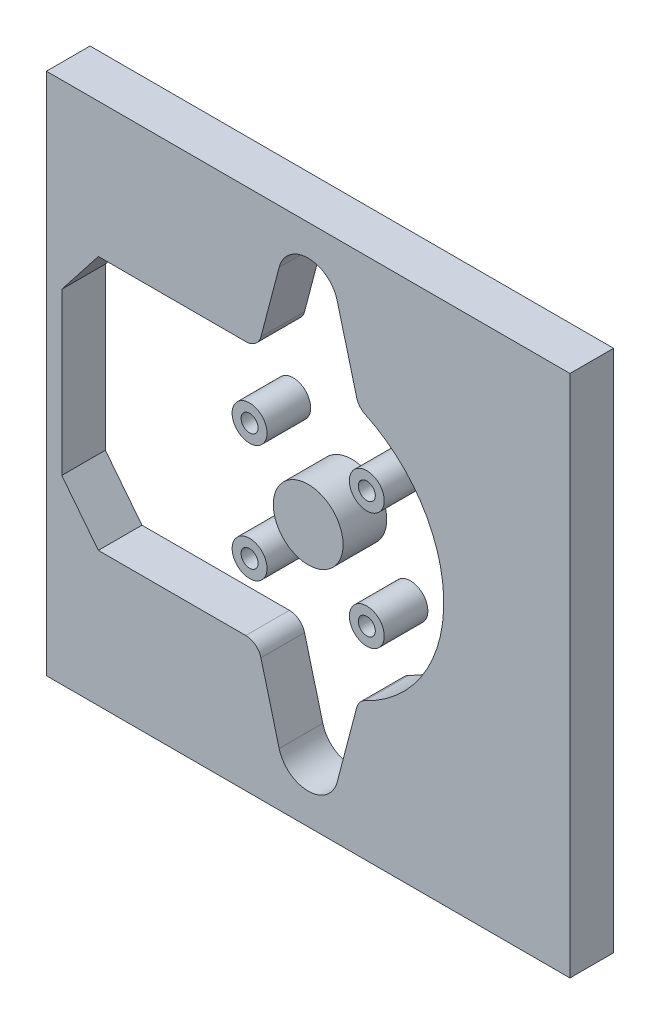
ISO-10303-21;
HEADER;
FILE_DESCRIPTION(('STEP AP214'),'2;1');
FILE_NAME('part.step','',(''),(''),'','','');
FILE_SCHEMA(('AUTOMOTIVE_DESIGN { 1 0 10303 214 1 1 1 1 }'));
ENDSEC;
DATA;
#1=APPLICATION_CONTEXT('core data for automotive mechanical design processes');
#2=APPLICATION_PROTOCOL_DEFINITION('international standard','automotive_design',2000,#1);
#3=PRODUCT_CONTEXT('',#1,'mechanical');
#4=PRODUCT('Part','Part','',(#3));
#5=PRODUCT_RELATED_PRODUCT_CATEGORY('part','',(#4));
#6=PRODUCT_DEFINITION_FORMATION('','',#4);
#7=PRODUCT_DEFINITION_CONTEXT('part definition',#1,'design');
#8=PRODUCT_DEFINITION('design','',#6,#7);
#9=PRODUCT_DEFINITION_SHAPE('','',#8);
#10=(LENGTH_UNIT() NAMED_UNIT(*) SI_UNIT(.MILLI.,.METRE.));
#11=(NAMED_UNIT(*) PLANE_ANGLE_UNIT() SI_UNIT($,.RADIAN.));
#12=(NAMED_UNIT(*) SI_UNIT($,.STERADIAN.) SOLID_ANGLE_UNIT());
#13=UNCERTAINTY_MEASURE_WITH_UNIT(LENGTH_MEASURE(1.E-05),#10,'distance_accuracy_value','');
#14=(GEOMETRIC_REPRESENTATION_CONTEXT(3) GLOBAL_UNCERTAINTY_ASSIGNED_CONTEXT((#13)) GLOBAL_UNIT_ASSIGNED_CONTEXT((#10,
#11,#12)) REPRESENTATION_CONTEXT('',''));
#15=CARTESIAN_POINT('',(0.,0.,0.));
#16=DIRECTION('',(0.,0.,1.));
#17=DIRECTION('',(1.,0.,0.));
#18=AXIS2_PLACEMENT_3D('',#15,#16,#17);
#19=CARTESIAN_POINT('',(-6.71751442127221,6.71751442127219,5.));
#20=DIRECTION('',(0.,0.,-1.));
#21=DIRECTION('',(-1.,0.,0.));
#22=AXIS2_PLACEMENT_3D('',#19,#20,#21);
#23=CYLINDRICAL_SURFACE('',#22,2.);
#24=CARTESIAN_POINT('',(-6.71751442127221,6.71751442127219,5.));
#25=DIRECTION('',(0.,0.,-1.));
#26=DIRECTION('',(-1.,0.,0.));
#27=AXIS2_PLACEMENT_3D('',#24,#25,#26);
#28=CIRCLE('',#27,2.);
#29=CARTESIAN_POINT('',(-8.71751442127221,6.71751442127219,5.));
#30=VERTEX_POINT('',#29);
#31=EDGE_CURVE('E11',#30,#30,#28,.T.);
#32=ORIENTED_EDGE('',*,*,#31,.T.);
#33=EDGE_LOOP('',(#32));
#34=FACE_BOUND('',#33,.T.);
#35=CARTESIAN_POINT('',(-6.71751442127221,6.71751442127219,0.));
#36=DIRECTION('',(0.,0.,-1.));
#37=DIRECTION('',(-1.,0.,0.));
#38=AXIS2_PLACEMENT_3D('',#35,#36,#37);
#39=CIRCLE('',#38,2.);
#40=CARTESIAN_POINT('',(-8.71751442127221,6.71751442127219,0.));
#41=VERTEX_POINT('',#40);
#42=EDGE_CURVE('E47',#41,#41,#39,.T.);
#43=ORIENTED_EDGE('',*,*,#42,.F.);
#44=EDGE_LOOP('',(#43));
#45=FACE_BOUND('',#44,.T.);
#46=ADVANCED_FACE('F44',(#34,#45),#23,.T.);
#47=CARTESIAN_POINT('',(-6.71751442127221,6.71751442127219,5.));
#48=DIRECTION('',(0.,0.,-1.));
#49=DIRECTION('',(-1.,0.,0.));
#50=AXIS2_PLACEMENT_3D('',#47,#48,#49);
#51=PLANE('',#50);
#52=CARTESIAN_POINT('',(-6.71751442127221,6.71751442127219,5.));
#53=DIRECTION('',(0.,0.,-1.));
#54=DIRECTION('',(-1.,0.,0.));
#55=AXIS2_PLACEMENT_3D('',#52,#53,#54);
#56=CIRCLE('',#55,0.975);
#57=CARTESIAN_POINT('',(-7.69251442127221,6.71751442127219,5.));
#58=VERTEX_POINT('',#57);
#59=EDGE_CURVE('E54',#58,#58,#56,.T.);
#60=ORIENTED_EDGE('',*,*,#59,.T.);
#61=EDGE_LOOP('',(#60));
#62=FACE_BOUND('',#61,.T.);
#63=ORIENTED_EDGE('',*,*,#31,.F.);
#64=EDGE_LOOP('',(#63));
#65=FACE_BOUND('',#64,.T.);
#66=ADVANCED_FACE('F62',(#62,#65),#51,.F.);
#67=CARTESIAN_POINT('',(-6.71751442127221,6.71751442127219,0.));
#68=DIRECTION('',(0.,0.,-1.));
#69=DIRECTION('',(-1.,0.,0.));
#70=AXIS2_PLACEMENT_3D('',#67,#68,#69);
#71=PLANE('',#70);
#72=CARTESIAN_POINT('',(-6.71751442127221,6.71751442127219,0.));
#73=DIRECTION('',(0.,0.,-1.));
#74=DIRECTION('',(-1.,0.,0.));
#75=AXIS2_PLACEMENT_3D('',#72,#73,#74);
#76=CIRCLE('',#75,0.975);
#77=CARTESIAN_POINT('',(-7.69251442127221,6.71751442127219,0.));
#78=VERTEX_POINT('',#77);
#79=EDGE_CURVE('E56',#78,#78,#76,.T.);
#80=ORIENTED_EDGE('',*,*,#79,.F.);
#81=EDGE_LOOP('',(#80));
#82=FACE_BOUND('',#81,.T.);
#83=ORIENTED_EDGE('',*,*,#42,.T.);
#84=EDGE_LOOP('',(#83));
#85=FACE_BOUND('',#84,.T.);
#86=ADVANCED_FACE('F68',(#82,#85),#71,.T.);
#87=CARTESIAN_POINT('',(-6.71751442127221,6.71751442127219,5.));
#88=DIRECTION('',(0.,0.,-1.));
#89=DIRECTION('',(-1.,0.,0.));
#90=AXIS2_PLACEMENT_3D('',#87,#88,#89);
#91=CYLINDRICAL_SURFACE('',#90,0.975);
#92=ORIENTED_EDGE('',*,*,#59,.F.);
#93=EDGE_LOOP('',(#92));
#94=FACE_BOUND('',#93,.T.);
#95=ORIENTED_EDGE('',*,*,#79,.T.);
#96=EDGE_LOOP('',(#95));
#97=FACE_BOUND('',#96,.T.);
#98=ADVANCED_FACE('F65',(#94,#97),#91,.F.);
#99=CLOSED_SHELL('',(#46,#66,#86,#98));
#100=MANIFOLD_SOLID_BREP('B2',#99);
#101=CARTESIAN_POINT('',(-6.71751442127221,-6.71751442127219,5.));
#102=DIRECTION('',(0.,0.,-1.));
#103=DIRECTION('',(-1.,0.,0.));
#104=AXIS2_PLACEMENT_3D('',#101,#102,#103);
#105=CYLINDRICAL_SURFACE('',#104,2.);
#106=CARTESIAN_POINT('',(-6.71751442127221,-6.71751442127219,5.));
#107=DIRECTION('',(0.,0.,-1.));
#108=DIRECTION('',(1.,0.,0.));
#109=AXIS2_PLACEMENT_3D('',#106,#107,#108);
#110=CIRCLE('',#109,2.);
#111=CARTESIAN_POINT('',(-4.71751442127221,-6.71751442127219,5.));
#112=VERTEX_POINT('',#111);
#113=EDGE_CURVE('E43',#112,#112,#110,.T.);
#114=ORIENTED_EDGE('',*,*,#113,.T.);
#115=EDGE_LOOP('',(#114));
#116=FACE_BOUND('',#115,.T.);
#117=CARTESIAN_POINT('',(-6.71751442127221,-6.71751442127219,0.));
#118=DIRECTION('',(0.,0.,-1.));
#119=DIRECTION('',(1.,0.,0.));
#120=AXIS2_PLACEMENT_3D('',#117,#118,#119);
#121=CIRCLE('',#120,2.);
#122=CARTESIAN_POINT('',(-4.71751442127221,-6.71751442127219,0.));
#123=VERTEX_POINT('',#122);
#124=EDGE_CURVE('E117',#123,#123,#121,.T.);
#125=ORIENTED_EDGE('',*,*,#124,.F.);
#126=EDGE_LOOP('',(#125));
#127=FACE_BOUND('',#126,.T.);
#128=ADVANCED_FACE('F114',(#116,#127),#105,.T.);
#129=CARTESIAN_POINT('',(-6.71751442127221,-6.71751442127219,5.));
#130=DIRECTION('',(0.,0.,1.));
#131=DIRECTION('',(1.,0.,0.));
#132=AXIS2_PLACEMENT_3D('',#129,#130,#131);
#133=PLANE('',#132);
#134=CARTESIAN_POINT('',(-6.71751442127221,-6.71751442127219,5.));
#135=DIRECTION('',(0.,0.,-1.));
#136=DIRECTION('',(-1.,0.,0.));
#137=AXIS2_PLACEMENT_3D('',#134,#135,#136);
#138=CIRCLE('',#137,0.975);
#139=CARTESIAN_POINT('',(-7.69251442127221,-6.71751442127219,5.));
#140=VERTEX_POINT('',#139);
#141=EDGE_CURVE('E124',#140,#140,#138,.T.);
#142=ORIENTED_EDGE('',*,*,#141,.T.);
#143=EDGE_LOOP('',(#142));
#144=FACE_BOUND('',#143,.T.);
#145=ORIENTED_EDGE('',*,*,#113,.F.);
#146=EDGE_LOOP('',(#145));
#147=FACE_BOUND('',#146,.T.);
#148=ADVANCED_FACE('F132',(#144,#147),#133,.T.);
#149=CARTESIAN_POINT('',(-6.71751442127221,-6.71751442127219,0.));
#150=DIRECTION('',(0.,0.,1.));
#151=DIRECTION('',(1.,0.,0.));
#152=AXIS2_PLACEMENT_3D('',#149,#150,#151);
#153=PLANE('',#152);
#154=CARTESIAN_POINT('',(-6.71751442127221,-6.71751442127219,0.));
#155=DIRECTION('',(0.,0.,-1.));
#156=DIRECTION('',(-1.,0.,0.));
#157=AXIS2_PLACEMENT_3D('',#154,#155,#156);
#158=CIRCLE('',#157,0.975);
#159=CARTESIAN_POINT('',(-7.69251442127221,-6.71751442127219,0.));
#160=VERTEX_POINT('',#159);
#161=EDGE_CURVE('E126',#160,#160,#158,.T.);
#162=ORIENTED_EDGE('',*,*,#161,.F.);
#163=EDGE_LOOP('',(#162));
#164=FACE_BOUND('',#163,.T.);
#165=ORIENTED_EDGE('',*,*,#124,.T.);
#166=EDGE_LOOP('',(#165));
#167=FACE_BOUND('',#166,.T.);
#168=ADVANCED_FACE('F138',(#164,#167),#153,.F.);
#169=CARTESIAN_POINT('',(-6.71751442127221,-6.71751442127219,5.));
#170=DIRECTION('',(0.,0.,-1.));
#171=DIRECTION('',(-1.,0.,0.));
#172=AXIS2_PLACEMENT_3D('',#169,#170,#171);
#173=CYLINDRICAL_SURFACE('',#172,0.975);
#174=ORIENTED_EDGE('',*,*,#141,.F.);
#175=EDGE_LOOP('',(#174));
#176=FACE_BOUND('',#175,.T.);
#177=ORIENTED_EDGE('',*,*,#161,.T.);
#178=EDGE_LOOP('',(#177));
#179=FACE_BOUND('',#178,.T.);
#180=ADVANCED_FACE('F135',(#176,#179),#173,.F.);
#181=CLOSED_SHELL('',(#128,#148,#168,#180));
#182=MANIFOLD_SOLID_BREP('B6',#181);
#183=CARTESIAN_POINT('',(6.71751442127221,6.71751442127219,5.));
#184=DIRECTION('',(0.,0.,-1.));
#185=DIRECTION('',(-1.,0.,0.));
#186=AXIS2_PLACEMENT_3D('',#183,#184,#185);
#187=CYLINDRICAL_SURFACE('',#186,2.);
#188=CARTESIAN_POINT('',(6.71751442127221,6.71751442127219,5.));
#189=DIRECTION('',(0.,0.,-1.));
#190=DIRECTION('',(1.,0.,0.));
#191=AXIS2_PLACEMENT_3D('',#188,#189,#190);
#192=CIRCLE('',#191,2.);
#193=CARTESIAN_POINT('',(8.71751442127221,6.71751442127219,5.));
#194=VERTEX_POINT('',#193);
#195=EDGE_CURVE('E113',#194,#194,#192,.T.);
#196=ORIENTED_EDGE('',*,*,#195,.T.);
#197=EDGE_LOOP('',(#196));
#198=FACE_BOUND('',#197,.T.);
#199=CARTESIAN_POINT('',(6.71751442127221,6.71751442127219,0.));
#200=DIRECTION('',(0.,0.,-1.));
#201=DIRECTION('',(1.,0.,0.));
#202=AXIS2_PLACEMENT_3D('',#199,#200,#201);
#203=CIRCLE('',#202,2.);
#204=CARTESIAN_POINT('',(8.71751442127221,6.71751442127219,0.));
#205=VERTEX_POINT('',#204);
#206=EDGE_CURVE('E187',#205,#205,#203,.T.);
#207=ORIENTED_EDGE('',*,*,#206,.F.);
#208=EDGE_LOOP('',(#207));
#209=FACE_BOUND('',#208,.T.);
#210=ADVANCED_FACE('F184',(#198,#209),#187,.T.);
#211=CARTESIAN_POINT('',(6.71751442127221,6.71751442127219,5.));
#212=DIRECTION('',(0.,0.,1.));
#213=DIRECTION('',(1.,0.,0.));
#214=AXIS2_PLACEMENT_3D('',#211,#212,#213);
#215=PLANE('',#214);
#216=CARTESIAN_POINT('',(6.71751442127221,6.71751442127219,5.));
#217=DIRECTION('',(0.,0.,-1.));
#218=DIRECTION('',(-1.,0.,0.));
#219=AXIS2_PLACEMENT_3D('',#216,#217,#218);
#220=CIRCLE('',#219,0.975);
#221=CARTESIAN_POINT('',(5.74251442127221,6.71751442127219,5.));
#222=VERTEX_POINT('',#221);
#223=EDGE_CURVE('E194',#222,#222,#220,.T.);
#224=ORIENTED_EDGE('',*,*,#223,.T.);
#225=EDGE_LOOP('',(#224));
#226=FACE_BOUND('',#225,.T.);
#227=ORIENTED_EDGE('',*,*,#195,.F.);
#228=EDGE_LOOP('',(#227));
#229=FACE_BOUND('',#228,.T.);
#230=ADVANCED_FACE('F202',(#226,#229),#215,.T.);
#231=CARTESIAN_POINT('',(6.71751442127221,6.71751442127219,0.));
#232=DIRECTION('',(0.,0.,1.));
#233=DIRECTION('',(1.,0.,0.));
#234=AXIS2_PLACEMENT_3D('',#231,#232,#233);
#235=PLANE('',#234);
#236=CARTESIAN_POINT('',(6.71751442127221,6.71751442127219,0.));
#237=DIRECTION('',(0.,0.,-1.));
#238=DIRECTION('',(-1.,0.,0.));
#239=AXIS2_PLACEMENT_3D('',#236,#237,#238);
#240=CIRCLE('',#239,0.975);
#241=CARTESIAN_POINT('',(5.74251442127221,6.71751442127219,0.));
#242=VERTEX_POINT('',#241);
#243=EDGE_CURVE('E196',#242,#242,#240,.T.);
#244=ORIENTED_EDGE('',*,*,#243,.F.);
#245=EDGE_LOOP('',(#244));
#246=FACE_BOUND('',#245,.T.);
#247=ORIENTED_EDGE('',*,*,#206,.T.);
#248=EDGE_LOOP('',(#247));
#249=FACE_BOUND('',#248,.T.);
#250=ADVANCED_FACE('F208',(#246,#249),#235,.F.);
#251=CARTESIAN_POINT('',(6.71751442127221,6.71751442127219,5.));
#252=DIRECTION('',(0.,0.,-1.));
#253=DIRECTION('',(-1.,0.,0.));
#254=AXIS2_PLACEMENT_3D('',#251,#252,#253);
#255=CYLINDRICAL_SURFACE('',#254,0.975);
#256=ORIENTED_EDGE('',*,*,#223,.F.);
#257=EDGE_LOOP('',(#256));
#258=FACE_BOUND('',#257,.T.);
#259=ORIENTED_EDGE('',*,*,#243,.T.);
#260=EDGE_LOOP('',(#259));
#261=FACE_BOUND('',#260,.T.);
#262=ADVANCED_FACE('F205',(#258,#261),#255,.F.);
#263=CLOSED_SHELL('',(#210,#230,#250,#262));
#264=MANIFOLD_SOLID_BREP('B38',#263);
#265=CARTESIAN_POINT('',(6.71751442127221,-6.71751442127219,5.));
#266=DIRECTION('',(0.,0.,-1.));
#267=DIRECTION('',(-1.,0.,0.));
#268=AXIS2_PLACEMENT_3D('',#265,#266,#267);
#269=CYLINDRICAL_SURFACE('',#268,2.);
#270=CARTESIAN_POINT('',(6.71751442127221,-6.71751442127219,5.));
#271=DIRECTION('',(0.,0.,-1.));
#272=DIRECTION('',(-1.,0.,0.));
#273=AXIS2_PLACEMENT_3D('',#270,#271,#272);
#274=CIRCLE('',#273,2.);
#275=CARTESIAN_POINT('',(4.71751442127221,-6.71751442127219,5.));
#276=VERTEX_POINT('',#275);
#277=EDGE_CURVE('E183',#276,#276,#274,.T.);
#278=ORIENTED_EDGE('',*,*,#277,.T.);
#279=EDGE_LOOP('',(#278));
#280=FACE_BOUND('',#279,.T.);
#281=CARTESIAN_POINT('',(6.71751442127221,-6.71751442127219,0.));
#282=DIRECTION('',(0.,0.,-1.));
#283=DIRECTION('',(-1.,0.,0.));
#284=AXIS2_PLACEMENT_3D('',#281,#282,#283);
#285=CIRCLE('',#284,2.);
#286=CARTESIAN_POINT('',(4.71751442127221,-6.71751442127219,0.));
#287=VERTEX_POINT('',#286);
#288=EDGE_CURVE('E259',#287,#287,#285,.T.);
#289=ORIENTED_EDGE('',*,*,#288,.F.);
#290=EDGE_LOOP('',(#289));
#291=FACE_BOUND('',#290,.T.);
#292=ADVANCED_FACE('F256',(#280,#291),#269,.T.);
#293=CARTESIAN_POINT('',(6.71751442127221,-6.71751442127219,5.));
#294=DIRECTION('',(0.,0.,-1.));
#295=DIRECTION('',(-1.,0.,0.));
#296=AXIS2_PLACEMENT_3D('',#293,#294,#295);
#297=PLANE('',#296);
#298=CARTESIAN_POINT('',(6.71751442127221,-6.71751442127219,5.));
#299=DIRECTION('',(0.,0.,-1.));
#300=DIRECTION('',(-1.,0.,0.));
#301=AXIS2_PLACEMENT_3D('',#298,#299,#300);
#302=CIRCLE('',#301,0.975);
#303=CARTESIAN_POINT('',(5.74251442127221,-6.71751442127219,5.));
#304=VERTEX_POINT('',#303);
#305=EDGE_CURVE('E266',#304,#304,#302,.T.);
#306=ORIENTED_EDGE('',*,*,#305,.T.);
#307=EDGE_LOOP('',(#306));
#308=FACE_BOUND('',#307,.T.);
#309=ORIENTED_EDGE('',*,*,#277,.F.);
#310=EDGE_LOOP('',(#309));
#311=FACE_BOUND('',#310,.T.);
#312=ADVANCED_FACE('F274',(#308,#311),#297,.F.);
#313=CARTESIAN_POINT('',(6.71751442127221,-6.71751442127219,0.));
#314=DIRECTION('',(0.,0.,-1.));
#315=DIRECTION('',(-1.,0.,0.));
#316=AXIS2_PLACEMENT_3D('',#313,#314,#315);
#317=PLANE('',#316);
#318=CARTESIAN_POINT('',(6.71751442127221,-6.71751442127219,0.));
#319=DIRECTION('',(0.,0.,-1.));
#320=DIRECTION('',(-1.,0.,0.));
#321=AXIS2_PLACEMENT_3D('',#318,#319,#320);
#322=CIRCLE('',#321,0.975);
#323=CARTESIAN_POINT('',(5.74251442127221,-6.71751442127219,0.));
#324=VERTEX_POINT('',#323);
#325=EDGE_CURVE('E268',#324,#324,#322,.T.);
#326=ORIENTED_EDGE('',*,*,#325,.F.);
#327=EDGE_LOOP('',(#326));
#328=FACE_BOUND('',#327,.T.);
#329=ORIENTED_EDGE('',*,*,#288,.T.);
#330=EDGE_LOOP('',(#329));
#331=FACE_BOUND('',#330,.T.);
#332=ADVANCED_FACE('F280',(#328,#331),#317,.T.);
#333=CARTESIAN_POINT('',(6.71751442127221,-6.71751442127219,5.));
#334=DIRECTION('',(0.,0.,-1.));
#335=DIRECTION('',(-1.,0.,0.));
#336=AXIS2_PLACEMENT_3D('',#333,#334,#335);
#337=CYLINDRICAL_SURFACE('',#336,0.975);
#338=ORIENTED_EDGE('',*,*,#305,.F.);
#339=EDGE_LOOP('',(#338));
#340=FACE_BOUND('',#339,.T.);
#341=ORIENTED_EDGE('',*,*,#325,.T.);
#342=EDGE_LOOP('',(#341));
#343=FACE_BOUND('',#342,.T.);
#344=ADVANCED_FACE('F277',(#340,#343),#337,.F.);
#345=CLOSED_SHELL('',(#292,#312,#332,#344));
#346=MANIFOLD_SOLID_BREP('B108',#345);
#347=CARTESIAN_POINT('',(0.,0.,5.));
#348=DIRECTION('',(0.,0.,1.));
#349=DIRECTION('',(1.,0.,0.));
#350=AXIS2_PLACEMENT_3D('',#347,#348,#349);
#351=PLANE('',#350);
#352=DIRECTION('',(0.,-1.,0.));
#353=VECTOR('',#352,1.);
#354=CARTESIAN_POINT('',(-30.,30.,5.));
#355=LINE('',#354,#353);
#356=CARTESIAN_POINT('',(-30.,30.,5.));
#357=VERTEX_POINT('',#356);
#358=CARTESIAN_POINT('',(-30.,-30.,5.));
#359=VERTEX_POINT('',#358);
#360=EDGE_CURVE('E328',#357,#359,#355,.T.);
#361=ORIENTED_EDGE('',*,*,#360,.T.);
#362=DIRECTION('',(1.,0.,0.));
#363=VECTOR('',#362,1.);
#364=CARTESIAN_POINT('',(-30.,-30.,5.));
#365=LINE('',#364,#363);
#366=CARTESIAN_POINT('',(30.,-30.,5.));
#367=VERTEX_POINT('',#366);
#368=EDGE_CURVE('E613',#359,#367,#365,.T.);
#369=ORIENTED_EDGE('',*,*,#368,.T.);
#370=DIRECTION('',(0.,1.,0.));
#371=VECTOR('',#370,1.);
#372=CARTESIAN_POINT('',(30.,30.,5.));
#373=LINE('',#372,#371);
#374=CARTESIAN_POINT('',(30.,30.,5.));
#375=VERTEX_POINT('',#374);
#376=EDGE_CURVE('E612',#367,#375,#373,.T.);
#377=ORIENTED_EDGE('',*,*,#376,.T.);
#378=DIRECTION('',(-1.,0.,0.));
#379=VECTOR('',#378,1.);
#380=CARTESIAN_POINT('',(-30.,30.,5.));
#381=LINE('',#380,#379);
#382=EDGE_CURVE('E610',#375,#357,#381,.T.);
#383=ORIENTED_EDGE('',*,*,#382,.T.);
#384=EDGE_LOOP('',(#361,#369,#377,#383));
#385=FACE_BOUND('',#384,.T.);
#386=DIRECTION('',(0.,1.,0.));
#387=VECTOR('',#386,1.);
#388=CARTESIAN_POINT('',(-28.24,-9.23903975314602,5.));
#389=LINE('',#388,#387);
#390=CARTESIAN_POINT('',(-28.24,-9.23903975314602,5.));
#391=VERTEX_POINT('',#390);
#392=CARTESIAN_POINT('',(-28.24,9.23903975314603,5.));
#393=VERTEX_POINT('',#392);
#394=EDGE_CURVE('E465',#391,#393,#389,.T.);
#395=ORIENTED_EDGE('',*,*,#394,.T.);
#396=DIRECTION('',(0.616887828188147,0.787051083115519,0.));
#397=VECTOR('',#396,1.);
#398=CARTESIAN_POINT('',(-28.24,9.23903975314603,5.));
#399=LINE('',#398,#397);
#400=CARTESIAN_POINT('',(-24.0498554502874,14.585,5.));
#401=VERTEX_POINT('',#400);
#402=EDGE_CURVE('E474',#393,#401,#399,.T.);
#403=ORIENTED_EDGE('',*,*,#402,.T.);
#404=DIRECTION('',(1.,0.,0.));
#405=VECTOR('',#404,1.);
#406=CARTESIAN_POINT('',(-24.0498554502874,14.585,5.));
#407=LINE('',#406,#405);
#408=CARTESIAN_POINT('',(-7.15516550456273,14.585,5.));
#409=VERTEX_POINT('',#408);
#410=EDGE_CURVE('E341',#401,#409,#407,.T.);
#411=ORIENTED_EDGE('',*,*,#410,.T.);
#412=CARTESIAN_POINT('',(-7.15516550456273,16.385,5.));
#413=DIRECTION('',(0.,0.,1.));
#414=DIRECTION('',(-1.,0.,0.));
#415=AXIS2_PLACEMENT_3D('',#412,#413,#414);
#416=CIRCLE('',#415,1.8);
#417=CARTESIAN_POINT('',(-5.41417686667612,15.9278801439997,5.));
#418=VERTEX_POINT('',#417);
#419=EDGE_CURVE('E487',#409,#418,#416,.T.);
#420=ORIENTED_EDGE('',*,*,#419,.T.);
#421=DIRECTION('',(0.253955475555716,0.967215909937006,0.));
#422=VECTOR('',#421,1.);
#423=CARTESIAN_POINT('',(-5.41417686667612,15.9278801439997,5.));
#424=LINE('',#423,#422);
#425=CARTESIAN_POINT('',(-3.32480469040846,23.8854719472228,5.));
#426=VERTEX_POINT('',#425);
#427=EDGE_CURVE('E490',#418,#426,#424,.T.);
#428=ORIENTED_EDGE('',*,*,#427,.T.);
#429=CARTESIAN_POINT('',(0.,23.0125,5.));
#430=DIRECTION('',(0.,0.,-1.));
#431=DIRECTION('',(-1.,0.,0.));
#432=AXIS2_PLACEMENT_3D('',#429,#430,#431);
#433=CIRCLE('',#432,3.4375);
#434=CARTESIAN_POINT('',(3.32480469040846,23.8854719472228,5.));
#435=VERTEX_POINT('',#434);
#436=EDGE_CURVE('E493',#426,#435,#433,.T.);
#437=ORIENTED_EDGE('',*,*,#436,.T.);
#438=DIRECTION('',(0.253955475555716,-0.967215909937006,0.));
#439=VECTOR('',#438,1.);
#440=CARTESIAN_POINT('',(3.32480469040846,23.8854719472228,5.));
#441=LINE('',#440,#439);
#442=CARTESIAN_POINT('',(5.55993505559416,15.3727448825266,5.));
#443=VERTEX_POINT('',#442);
#444=EDGE_CURVE('E496',#435,#443,#441,.T.);
#445=ORIENTED_EDGE('',*,*,#444,.T.);
#446=CARTESIAN_POINT('',(7.30092369348078,15.8298647385269,5.));
#447=DIRECTION('',(0.,0.,1.));
#448=DIRECTION('',(-1.,0.,0.));
#449=AXIS2_PLACEMENT_3D('',#446,#447,#448);
#450=CIRCLE('',#449,1.8);
#451=CARTESIAN_POINT('',(6.53351439929418,14.201650079707,5.));
#452=VERTEX_POINT('',#451);
#453=EDGE_CURVE('E499',#443,#452,#450,.T.);
#454=ORIENTED_EDGE('',*,*,#453,.T.);
#455=CARTESIAN_POINT('',(-0.160000000000004,0.,5.));
#456=DIRECTION('',(0.,0.,-1.));
#457=DIRECTION('',(-1.,0.,0.));
#458=AXIS2_PLACEMENT_3D('',#455,#456,#457);
#459=CIRCLE('',#458,15.7);
#460=CARTESIAN_POINT('',(6.53351439929418,-14.201650079707,5.));
#461=VERTEX_POINT('',#460);
#462=EDGE_CURVE('E502',#452,#461,#459,.T.);
#463=ORIENTED_EDGE('',*,*,#462,.T.);
#464=CARTESIAN_POINT('',(7.30092369348077,-15.8298647385269,5.));
#465=DIRECTION('',(0.,0.,1.));
#466=DIRECTION('',(-1.,0.,0.));
#467=AXIS2_PLACEMENT_3D('',#464,#465,#466);
#468=CIRCLE('',#467,1.8);
#469=CARTESIAN_POINT('',(5.55993505559416,-15.3727448825266,5.));
#470=VERTEX_POINT('',#469);
#471=EDGE_CURVE('E505',#461,#470,#468,.T.);
#472=ORIENTED_EDGE('',*,*,#471,.T.);
#473=DIRECTION('',(-0.253955475555716,-0.967215909937006,0.));
#474=VECTOR('',#473,1.);
#475=CARTESIAN_POINT('',(5.55993505559416,-15.3727448825266,5.));
#476=LINE('',#475,#474);
#477=CARTESIAN_POINT('',(3.32480469040846,-23.8854719472228,5.));
#478=VERTEX_POINT('',#477);
#479=EDGE_CURVE('E508',#470,#478,#476,.T.);
#480=ORIENTED_EDGE('',*,*,#479,.T.);
#481=CARTESIAN_POINT('',(0.,-23.0125,5.));
#482=DIRECTION('',(0.,0.,-1.));
#483=DIRECTION('',(-1.,0.,0.));
#484=AXIS2_PLACEMENT_3D('',#481,#482,#483);
#485=CIRCLE('',#484,3.4375);
#486=CARTESIAN_POINT('',(-3.32480469040846,-23.8854719472228,5.));
#487=VERTEX_POINT('',#486);
#488=EDGE_CURVE('E511',#478,#487,#485,.T.);
#489=ORIENTED_EDGE('',*,*,#488,.T.);
#490=DIRECTION('',(-0.253955475555716,0.967215909937006,0.));
#491=VECTOR('',#490,1.);
#492=CARTESIAN_POINT('',(-3.32480469040846,-23.8854719472228,5.));
#493=LINE('',#492,#491);
#494=CARTESIAN_POINT('',(-5.41417686667612,-15.9278801439997,5.));
#495=VERTEX_POINT('',#494);
#496=EDGE_CURVE('E514',#487,#495,#493,.T.);
#497=ORIENTED_EDGE('',*,*,#496,.T.);
#498=CARTESIAN_POINT('',(-7.15516550456273,-16.385,5.));
#499=DIRECTION('',(0.,0.,1.));
#500=DIRECTION('',(-1.,0.,0.));
#501=AXIS2_PLACEMENT_3D('',#498,#499,#500);
#502=CIRCLE('',#501,1.8);
#503=CARTESIAN_POINT('',(-7.15516550456273,-14.585,5.));
#504=VERTEX_POINT('',#503);
#505=EDGE_CURVE('E517',#495,#504,#502,.T.);
#506=ORIENTED_EDGE('',*,*,#505,.T.);
#507=DIRECTION('',(-1.,0.,0.));
#508=VECTOR('',#507,1.);
#509=CARTESIAN_POINT('',(-7.15516550456273,-14.585,5.));
#510=LINE('',#509,#508);
#511=CARTESIAN_POINT('',(-24.0498554502874,-14.585,5.));
#512=VERTEX_POINT('',#511);
#513=EDGE_CURVE('E520',#504,#512,#510,.T.);
#514=ORIENTED_EDGE('',*,*,#513,.T.);
#515=DIRECTION('',(-0.616887828188146,0.787051083115519,0.));
#516=VECTOR('',#515,1.);
#517=CARTESIAN_POINT('',(-24.0498554502874,-14.585,5.));
#518=LINE('',#517,#516);
#519=EDGE_CURVE('E471',#512,#391,#518,.T.);
#520=ORIENTED_EDGE('',*,*,#519,.T.);
#521=EDGE_LOOP('',(#395,#403,#411,#420,#428,#437,#445,#454,#463,#472,#480,#489,#497,#506,#514,#520));
#522=FACE_BOUND('',#521,.T.);
#523=ADVANCED_FACE('F325',(#385,#522),#351,.T.);
#524=CARTESIAN_POINT('',(0.,0.,0.));
#525=DIRECTION('',(0.,0.,1.));
#526=DIRECTION('',(1.,0.,0.));
#527=AXIS2_PLACEMENT_3D('',#524,#525,#526);
#528=PLANE('',#527);
#529=DIRECTION('',(0.,-1.,0.));
#530=VECTOR('',#529,1.);
#531=CARTESIAN_POINT('',(-30.,30.,0.));
#532=LINE('',#531,#530);
#533=CARTESIAN_POINT('',(-30.,30.,0.));
#534=VERTEX_POINT('',#533);
#535=CARTESIAN_POINT('',(-30.,-30.,0.));
#536=VERTEX_POINT('',#535);
#537=EDGE_CURVE('E604',#534,#536,#532,.T.);
#538=ORIENTED_EDGE('',*,*,#537,.F.);
#539=DIRECTION('',(-1.,0.,0.));
#540=VECTOR('',#539,1.);
#541=CARTESIAN_POINT('',(-30.,30.,0.));
#542=LINE('',#541,#540);
#543=CARTESIAN_POINT('',(30.,30.,0.));
#544=VERTEX_POINT('',#543);
#545=EDGE_CURVE('E333',#544,#534,#542,.T.);
#546=ORIENTED_EDGE('',*,*,#545,.F.);
#547=DIRECTION('',(0.,1.,0.));
#548=VECTOR('',#547,1.);
#549=CARTESIAN_POINT('',(30.,30.,0.));
#550=LINE('',#549,#548);
#551=CARTESIAN_POINT('',(30.,-30.,0.));
#552=VERTEX_POINT('',#551);
#553=EDGE_CURVE('E596',#552,#544,#550,.T.);
#554=ORIENTED_EDGE('',*,*,#553,.F.);
#555=DIRECTION('',(1.,0.,0.));
#556=VECTOR('',#555,1.);
#557=CARTESIAN_POINT('',(-30.,-30.,0.));
#558=LINE('',#557,#556);
#559=EDGE_CURVE('E597',#536,#552,#558,.T.);
#560=ORIENTED_EDGE('',*,*,#559,.F.);
#561=EDGE_LOOP('',(#538,#546,#554,#560));
#562=FACE_BOUND('',#561,.T.);
#563=DIRECTION('',(0.616887828188147,0.787051083115519,0.));
#564=VECTOR('',#563,1.);
#565=CARTESIAN_POINT('',(-28.24,9.23903975314603,0.));
#566=LINE('',#565,#564);
#567=CARTESIAN_POINT('',(-28.24,9.23903975314603,0.));
#568=VERTEX_POINT('',#567);
#569=CARTESIAN_POINT('',(-24.0498554502874,14.585,0.));
#570=VERTEX_POINT('',#569);
#571=EDGE_CURVE('E524',#568,#570,#566,.T.);
#572=ORIENTED_EDGE('',*,*,#571,.F.);
#573=DIRECTION('',(0.,1.,0.));
#574=VECTOR('',#573,1.);
#575=CARTESIAN_POINT('',(-28.24,-9.23903975314602,0.));
#576=LINE('',#575,#574);
#577=CARTESIAN_POINT('',(-28.24,-9.23903975314602,0.));
#578=VERTEX_POINT('',#577);
#579=EDGE_CURVE('E349',#578,#568,#576,.T.);
#580=ORIENTED_EDGE('',*,*,#579,.F.);
#581=DIRECTION('',(-0.616887828188146,0.787051083115519,0.));
#582=VECTOR('',#581,1.);
#583=CARTESIAN_POINT('',(-24.0498554502874,-14.585,0.));
#584=LINE('',#583,#582);
#585=CARTESIAN_POINT('',(-24.0498554502874,-14.585,0.));
#586=VERTEX_POINT('',#585);
#587=EDGE_CURVE('E480',#586,#578,#584,.T.);
#588=ORIENTED_EDGE('',*,*,#587,.F.);
#589=DIRECTION('',(-1.,0.,0.));
#590=VECTOR('',#589,1.);
#591=CARTESIAN_POINT('',(-7.15516550456273,-14.585,0.));
#592=LINE('',#591,#590);
#593=CARTESIAN_POINT('',(-7.15516550456273,-14.585,0.));
#594=VERTEX_POINT('',#593);
#595=EDGE_CURVE('E483',#594,#586,#592,.T.);
#596=ORIENTED_EDGE('',*,*,#595,.F.);
#597=CARTESIAN_POINT('',(-7.15516550456273,-16.385,0.));
#598=DIRECTION('',(0.,0.,1.));
#599=DIRECTION('',(-1.,0.,0.));
#600=AXIS2_PLACEMENT_3D('',#597,#598,#599);
#601=CIRCLE('',#600,1.8);
#602=CARTESIAN_POINT('',(-5.41417686667612,-15.9278801439997,0.));
#603=VERTEX_POINT('',#602);
#604=EDGE_CURVE('E559',#603,#594,#601,.T.);
#605=ORIENTED_EDGE('',*,*,#604,.F.);
#606=DIRECTION('',(-0.253955475555716,0.967215909937006,0.));
#607=VECTOR('',#606,1.);
#608=CARTESIAN_POINT('',(-3.32480469040846,-23.8854719472228,0.));
#609=LINE('',#608,#607);
#610=CARTESIAN_POINT('',(-3.32480469040846,-23.8854719472228,0.));
#611=VERTEX_POINT('',#610);
#612=EDGE_CURVE('E556',#611,#603,#609,.T.);
#613=ORIENTED_EDGE('',*,*,#612,.F.);
#614=CARTESIAN_POINT('',(0.,-23.0125,0.));
#615=DIRECTION('',(0.,0.,-1.));
#616=DIRECTION('',(-1.,0.,0.));
#617=AXIS2_PLACEMENT_3D('',#614,#615,#616);
#618=CIRCLE('',#617,3.4375);
#619=CARTESIAN_POINT('',(3.32480469040846,-23.8854719472228,0.));
#620=VERTEX_POINT('',#619);
#621=EDGE_CURVE('E553',#620,#611,#618,.T.);
#622=ORIENTED_EDGE('',*,*,#621,.F.);
#623=DIRECTION('',(-0.253955475555716,-0.967215909937006,0.));
#624=VECTOR('',#623,1.);
#625=CARTESIAN_POINT('',(5.55993505559416,-15.3727448825266,0.));
#626=LINE('',#625,#624);
#627=CARTESIAN_POINT('',(5.55993505559416,-15.3727448825266,0.));
#628=VERTEX_POINT('',#627);
#629=EDGE_CURVE('E550',#628,#620,#626,.T.);
#630=ORIENTED_EDGE('',*,*,#629,.F.);
#631=CARTESIAN_POINT('',(7.30092369348077,-15.8298647385269,0.));
#632=DIRECTION('',(0.,0.,1.));
#633=DIRECTION('',(-1.,0.,0.));
#634=AXIS2_PLACEMENT_3D('',#631,#632,#633);
#635=CIRCLE('',#634,1.8);
#636=CARTESIAN_POINT('',(6.53351439929418,-14.201650079707,0.));
#637=VERTEX_POINT('',#636);
#638=EDGE_CURVE('E547',#637,#628,#635,.T.);
#639=ORIENTED_EDGE('',*,*,#638,.F.);
#640=CARTESIAN_POINT('',(-0.160000000000004,0.,0.));
#641=DIRECTION('',(0.,0.,-1.));
#642=DIRECTION('',(-1.,0.,0.));
#643=AXIS2_PLACEMENT_3D('',#640,#641,#642);
#644=CIRCLE('',#643,15.7);
#645=CARTESIAN_POINT('',(6.53351439929418,14.201650079707,0.));
#646=VERTEX_POINT('',#645);
#647=EDGE_CURVE('E544',#646,#637,#644,.T.);
#648=ORIENTED_EDGE('',*,*,#647,.F.);
#649=CARTESIAN_POINT('',(7.30092369348078,15.8298647385269,0.));
#650=DIRECTION('',(0.,0.,1.));
#651=DIRECTION('',(-1.,0.,0.));
#652=AXIS2_PLACEMENT_3D('',#649,#650,#651);
#653=CIRCLE('',#652,1.8);
#654=CARTESIAN_POINT('',(5.55993505559416,15.3727448825266,0.));
#655=VERTEX_POINT('',#654);
#656=EDGE_CURVE('E541',#655,#646,#653,.T.);
#657=ORIENTED_EDGE('',*,*,#656,.F.);
#658=DIRECTION('',(0.253955475555716,-0.967215909937006,0.));
#659=VECTOR('',#658,1.);
#660=CARTESIAN_POINT('',(3.32480469040846,23.8854719472228,0.));
#661=LINE('',#660,#659);
#662=CARTESIAN_POINT('',(3.32480469040846,23.8854719472228,0.));
#663=VERTEX_POINT('',#662);
#664=EDGE_CURVE('E538',#663,#655,#661,.T.);
#665=ORIENTED_EDGE('',*,*,#664,.F.);
#666=CARTESIAN_POINT('',(0.,23.0125,0.));
#667=DIRECTION('',(0.,0.,-1.));
#668=DIRECTION('',(-1.,0.,0.));
#669=AXIS2_PLACEMENT_3D('',#666,#667,#668);
#670=CIRCLE('',#669,3.4375);
#671=CARTESIAN_POINT('',(-3.32480469040846,23.8854719472228,0.));
#672=VERTEX_POINT('',#671);
#673=EDGE_CURVE('E535',#672,#663,#670,.T.);
#674=ORIENTED_EDGE('',*,*,#673,.F.);
#675=DIRECTION('',(0.253955475555716,0.967215909937006,0.));
#676=VECTOR('',#675,1.);
#677=CARTESIAN_POINT('',(-5.41417686667612,15.9278801439997,0.));
#678=LINE('',#677,#676);
#679=CARTESIAN_POINT('',(-5.41417686667612,15.9278801439997,0.));
#680=VERTEX_POINT('',#679);
#681=EDGE_CURVE('E532',#680,#672,#678,.T.);
#682=ORIENTED_EDGE('',*,*,#681,.F.);
#683=CARTESIAN_POINT('',(-7.15516550456273,16.385,0.));
#684=DIRECTION('',(0.,0.,1.));
#685=DIRECTION('',(-1.,0.,0.));
#686=AXIS2_PLACEMENT_3D('',#683,#684,#685);
#687=CIRCLE('',#686,1.8);
#688=CARTESIAN_POINT('',(-7.15516550456273,14.585,0.));
#689=VERTEX_POINT('',#688);
#690=EDGE_CURVE('E529',#689,#680,#687,.T.);
#691=ORIENTED_EDGE('',*,*,#690,.F.);
#692=DIRECTION('',(1.,0.,0.));
#693=VECTOR('',#692,1.);
#694=CARTESIAN_POINT('',(-24.0498554502874,14.585,0.));
#695=LINE('',#694,#693);
#696=EDGE_CURVE('E526',#570,#689,#695,.T.);
#697=ORIENTED_EDGE('',*,*,#696,.F.);
#698=EDGE_LOOP('',(#572,#580,#588,#596,#605,#613,#622,#630,#639,#648,#657,#665,#674,#682,#691,#697));
#699=FACE_BOUND('',#698,.T.);
#700=ADVANCED_FACE('F635',(#562,#699),#528,.F.);
#701=CARTESIAN_POINT('',(-30.,30.,5.));
#702=DIRECTION('',(1.,0.,0.));
#703=DIRECTION('',(0.,0.,-1.));
#704=AXIS2_PLACEMENT_3D('',#701,#702,#703);
#705=PLANE('',#704);
#706=ORIENTED_EDGE('',*,*,#537,.T.);
#707=DIRECTION('',(0.,0.,-1.));
#708=VECTOR('',#707,1.);
#709=CARTESIAN_POINT('',(-30.,-30.,5.));
#710=LINE('',#709,#708);
#711=EDGE_CURVE('E593',#359,#536,#710,.T.);
#712=ORIENTED_EDGE('',*,*,#711,.F.);
#713=ORIENTED_EDGE('',*,*,#360,.F.);
#714=DIRECTION('',(0.,0.,-1.));
#715=VECTOR('',#714,1.);
#716=CARTESIAN_POINT('',(-30.,30.,5.));
#717=LINE('',#716,#715);
#718=EDGE_CURVE('E601',#357,#534,#717,.T.);
#719=ORIENTED_EDGE('',*,*,#718,.T.);
#720=EDGE_LOOP('',(#706,#712,#713,#719));
#721=FACE_BOUND('',#720,.T.);
#722=ADVANCED_FACE('F622',(#721),#705,.F.);
#723=CARTESIAN_POINT('',(-30.,-30.,5.));
#724=DIRECTION('',(0.,1.,0.));
#725=DIRECTION('',(0.,0.,1.));
#726=AXIS2_PLACEMENT_3D('',#723,#724,#725);
#727=PLANE('',#726);
#728=ORIENTED_EDGE('',*,*,#559,.T.);
#729=DIRECTION('',(0.,0.,-1.));
#730=VECTOR('',#729,1.);
#731=CARTESIAN_POINT('',(30.,-30.,5.));
#732=LINE('',#731,#730);
#733=EDGE_CURVE('E598',#367,#552,#732,.T.);
#734=ORIENTED_EDGE('',*,*,#733,.F.);
#735=ORIENTED_EDGE('',*,*,#368,.F.);
#736=ORIENTED_EDGE('',*,*,#711,.T.);
#737=EDGE_LOOP('',(#728,#734,#735,#736));
#738=FACE_BOUND('',#737,.T.);
#739=ADVANCED_FACE('F625',(#738),#727,.F.);
#740=CARTESIAN_POINT('',(30.,30.,5.));
#741=DIRECTION('',(-1.,0.,0.));
#742=DIRECTION('',(0.,0.,1.));
#743=AXIS2_PLACEMENT_3D('',#740,#741,#742);
#744=PLANE('',#743);
#745=ORIENTED_EDGE('',*,*,#553,.T.);
#746=DIRECTION('',(0.,0.,-1.));
#747=VECTOR('',#746,1.);
#748=CARTESIAN_POINT('',(30.,30.,5.));
#749=LINE('',#748,#747);
#750=EDGE_CURVE('E254',#375,#544,#749,.T.);
#751=ORIENTED_EDGE('',*,*,#750,.F.);
#752=ORIENTED_EDGE('',*,*,#376,.F.);
#753=ORIENTED_EDGE('',*,*,#733,.T.);
#754=EDGE_LOOP('',(#745,#751,#752,#753));
#755=FACE_BOUND('',#754,.T.);
#756=ADVANCED_FACE('F630',(#755),#744,.F.);
#757=CARTESIAN_POINT('',(-30.,30.,5.));
#758=DIRECTION('',(0.,-1.,0.));
#759=DIRECTION('',(0.,0.,-1.));
#760=AXIS2_PLACEMENT_3D('',#757,#758,#759);
#761=PLANE('',#760);
#762=ORIENTED_EDGE('',*,*,#545,.T.);
#763=ORIENTED_EDGE('',*,*,#718,.F.);
#764=ORIENTED_EDGE('',*,*,#382,.F.);
#765=ORIENTED_EDGE('',*,*,#750,.T.);
#766=EDGE_LOOP('',(#762,#763,#764,#765));
#767=FACE_BOUND('',#766,.T.);
#768=ADVANCED_FACE('F633',(#767),#761,.F.);
#769=CARTESIAN_POINT('',(-28.24,-9.23903975314602,5.));
#770=DIRECTION('',(-1.,0.,0.));
#771=DIRECTION('',(0.,0.,1.));
#772=AXIS2_PLACEMENT_3D('',#769,#770,#771);
#773=PLANE('',#772);
#774=ORIENTED_EDGE('',*,*,#579,.T.);
#775=DIRECTION('',(0.,0.,-1.));
#776=VECTOR('',#775,1.);
#777=CARTESIAN_POINT('',(-28.24,9.23903975314603,5.));
#778=LINE('',#777,#776);
#779=EDGE_CURVE('E461',#393,#568,#778,.T.);
#780=ORIENTED_EDGE('',*,*,#779,.F.);
#781=ORIENTED_EDGE('',*,*,#394,.F.);
#782=DIRECTION('',(0.,0.,-1.));
#783=VECTOR('',#782,1.);
#784=CARTESIAN_POINT('',(-28.24,-9.23903975314602,5.));
#785=LINE('',#784,#783);
#786=EDGE_CURVE('E564',#391,#578,#785,.T.);
#787=ORIENTED_EDGE('',*,*,#786,.T.);
#788=EDGE_LOOP('',(#774,#780,#781,#787));
#789=FACE_BOUND('',#788,.T.);
#790=ADVANCED_FACE('F463',(#789),#773,.F.);
#791=CARTESIAN_POINT('',(-24.0498554502874,-14.585,5.));
#792=DIRECTION('',(-0.787051083115519,-0.616887828188146,0.));
#793=DIRECTION('',(0.616887828188146,-0.787051083115519,0.));
#794=AXIS2_PLACEMENT_3D('',#791,#792,#793);
#795=PLANE('',#794);
#796=ORIENTED_EDGE('',*,*,#587,.T.);
#797=ORIENTED_EDGE('',*,*,#786,.F.);
#798=ORIENTED_EDGE('',*,*,#519,.F.);
#799=DIRECTION('',(0.,0.,-1.));
#800=VECTOR('',#799,1.);
#801=CARTESIAN_POINT('',(-24.0498554502874,-14.585,5.));
#802=LINE('',#801,#800);
#803=EDGE_CURVE('E566',#512,#586,#802,.T.);
#804=ORIENTED_EDGE('',*,*,#803,.T.);
#805=EDGE_LOOP('',(#796,#797,#798,#804));
#806=FACE_BOUND('',#805,.T.);
#807=ADVANCED_FACE('F690',(#806),#795,.F.);
#808=CARTESIAN_POINT('',(-7.15516550456273,-14.585,5.));
#809=DIRECTION('',(0.,-1.,0.));
#810=DIRECTION('',(1.,0.,0.));
#811=AXIS2_PLACEMENT_3D('',#808,#809,#810);
#812=PLANE('',#811);
#813=ORIENTED_EDGE('',*,*,#595,.T.);
#814=ORIENTED_EDGE('',*,*,#803,.F.);
#815=ORIENTED_EDGE('',*,*,#513,.F.);
#816=DIRECTION('',(0.,0.,-1.));
#817=VECTOR('',#816,1.);
#818=CARTESIAN_POINT('',(-7.15516550456273,-14.585,5.));
#819=LINE('',#818,#817);
#820=EDGE_CURVE('E568',#504,#594,#819,.T.);
#821=ORIENTED_EDGE('',*,*,#820,.T.);
#822=EDGE_LOOP('',(#813,#814,#815,#821));
#823=FACE_BOUND('',#822,.T.);
#824=ADVANCED_FACE('F688',(#823),#812,.F.);
#825=CARTESIAN_POINT('',(-7.15516550456273,-16.385,5.));
#826=DIRECTION('',(0.,0.,-1.));
#827=DIRECTION('',(-1.,0.,0.));
#828=AXIS2_PLACEMENT_3D('',#825,#826,#827);
#829=CYLINDRICAL_SURFACE('',#828,1.8);
#830=ORIENTED_EDGE('',*,*,#604,.T.);
#831=ORIENTED_EDGE('',*,*,#820,.F.);
#832=ORIENTED_EDGE('',*,*,#505,.F.);
#833=DIRECTION('',(0.,0.,-1.));
#834=VECTOR('',#833,1.);
#835=CARTESIAN_POINT('',(-5.41417686667612,-15.9278801439997,5.));
#836=LINE('',#835,#834);
#837=EDGE_CURVE('E570',#495,#603,#836,.T.);
#838=ORIENTED_EDGE('',*,*,#837,.T.);
#839=EDGE_LOOP('',(#830,#831,#832,#838));
#840=FACE_BOUND('',#839,.T.);
#841=ADVANCED_FACE('F684',(#840),#829,.T.);
#842=CARTESIAN_POINT('',(-3.32480469040846,-23.8854719472228,5.));
#843=DIRECTION('',(-0.967215909937006,-0.253955475555716,0.));
#844=DIRECTION('',(0.253955475555716,-0.967215909937006,0.));
#845=AXIS2_PLACEMENT_3D('',#842,#843,#844);
#846=PLANE('',#845);
#847=ORIENTED_EDGE('',*,*,#612,.T.);
#848=ORIENTED_EDGE('',*,*,#837,.F.);
#849=ORIENTED_EDGE('',*,*,#496,.F.);
#850=DIRECTION('',(0.,0.,-1.));
#851=VECTOR('',#850,1.);
#852=CARTESIAN_POINT('',(-3.32480469040846,-23.8854719472228,5.));
#853=LINE('',#852,#851);
#854=EDGE_CURVE('E572',#487,#611,#853,.T.);
#855=ORIENTED_EDGE('',*,*,#854,.T.);
#856=EDGE_LOOP('',(#847,#848,#849,#855));
#857=FACE_BOUND('',#856,.T.);
#858=ADVANCED_FACE('F680',(#857),#846,.F.);
#859=CARTESIAN_POINT('',(0.,-23.0125,5.));
#860=DIRECTION('',(0.,0.,-1.));
#861=DIRECTION('',(-1.,0.,0.));
#862=AXIS2_PLACEMENT_3D('',#859,#860,#861);
#863=CYLINDRICAL_SURFACE('',#862,3.4375);
#864=ORIENTED_EDGE('',*,*,#621,.T.);
#865=ORIENTED_EDGE('',*,*,#854,.F.);
#866=ORIENTED_EDGE('',*,*,#488,.F.);
#867=DIRECTION('',(0.,0.,-1.));
#868=VECTOR('',#867,1.);
#869=CARTESIAN_POINT('',(3.32480469040846,-23.8854719472228,5.));
#870=LINE('',#869,#868);
#871=EDGE_CURVE('E574',#478,#620,#870,.T.);
#872=ORIENTED_EDGE('',*,*,#871,.T.);
#873=EDGE_LOOP('',(#864,#865,#866,#872));
#874=FACE_BOUND('',#873,.T.);
#875=ADVANCED_FACE('F676',(#874),#863,.F.);
#876=CARTESIAN_POINT('',(5.55993505559416,-15.3727448825266,5.));
#877=DIRECTION('',(0.967215909937006,-0.253955475555716,0.));
#878=DIRECTION('',(0.253955475555716,0.967215909937006,0.));
#879=AXIS2_PLACEMENT_3D('',#876,#877,#878);
#880=PLANE('',#879);
#881=ORIENTED_EDGE('',*,*,#629,.T.);
#882=ORIENTED_EDGE('',*,*,#871,.F.);
#883=ORIENTED_EDGE('',*,*,#479,.F.);
#884=DIRECTION('',(0.,0.,-1.));
#885=VECTOR('',#884,1.);
#886=CARTESIAN_POINT('',(5.55993505559416,-15.3727448825266,5.));
#887=LINE('',#886,#885);
#888=EDGE_CURVE('E576',#470,#628,#887,.T.);
#889=ORIENTED_EDGE('',*,*,#888,.T.);
#890=EDGE_LOOP('',(#881,#882,#883,#889));
#891=FACE_BOUND('',#890,.T.);
#892=ADVANCED_FACE('F672',(#891),#880,.F.);
#893=CARTESIAN_POINT('',(7.30092369348077,-15.8298647385269,5.));
#894=DIRECTION('',(0.,0.,-1.));
#895=DIRECTION('',(-1.,0.,0.));
#896=AXIS2_PLACEMENT_3D('',#893,#894,#895);
#897=CYLINDRICAL_SURFACE('',#896,1.8);
#898=ORIENTED_EDGE('',*,*,#638,.T.);
#899=ORIENTED_EDGE('',*,*,#888,.F.);
#900=ORIENTED_EDGE('',*,*,#471,.F.);
#901=DIRECTION('',(0.,0.,-1.));
#902=VECTOR('',#901,1.);
#903=CARTESIAN_POINT('',(6.53351439929418,-14.201650079707,5.));
#904=LINE('',#903,#902);
#905=EDGE_CURVE('E578',#461,#637,#904,.T.);
#906=ORIENTED_EDGE('',*,*,#905,.T.);
#907=EDGE_LOOP('',(#898,#899,#900,#906));
#908=FACE_BOUND('',#907,.T.);
#909=ADVANCED_FACE('F668',(#908),#897,.T.);
#910=CARTESIAN_POINT('',(-0.160000000000004,0.,5.));
#911=DIRECTION('',(0.,0.,-1.));
#912=DIRECTION('',(-1.,0.,0.));
#913=AXIS2_PLACEMENT_3D('',#910,#911,#912);
#914=CYLINDRICAL_SURFACE('',#913,15.7);
#915=ORIENTED_EDGE('',*,*,#647,.T.);
#916=ORIENTED_EDGE('',*,*,#905,.F.);
#917=ORIENTED_EDGE('',*,*,#462,.F.);
#918=DIRECTION('',(0.,0.,-1.));
#919=VECTOR('',#918,1.);
#920=CARTESIAN_POINT('',(6.53351439929418,14.201650079707,5.));
#921=LINE('',#920,#919);
#922=EDGE_CURVE('E580',#452,#646,#921,.T.);
#923=ORIENTED_EDGE('',*,*,#922,.T.);
#924=EDGE_LOOP('',(#915,#916,#917,#923));
#925=FACE_BOUND('',#924,.T.);
#926=ADVANCED_FACE('F664',(#925),#914,.F.);
#927=CARTESIAN_POINT('',(7.30092369348078,15.8298647385269,5.));
#928=DIRECTION('',(0.,0.,-1.));
#929=DIRECTION('',(-1.,0.,0.));
#930=AXIS2_PLACEMENT_3D('',#927,#928,#929);
#931=CYLINDRICAL_SURFACE('',#930,1.8);
#932=ORIENTED_EDGE('',*,*,#656,.T.);
#933=ORIENTED_EDGE('',*,*,#922,.F.);
#934=ORIENTED_EDGE('',*,*,#453,.F.);
#935=DIRECTION('',(0.,0.,-1.));
#936=VECTOR('',#935,1.);
#937=CARTESIAN_POINT('',(5.55993505559416,15.3727448825266,5.));
#938=LINE('',#937,#936);
#939=EDGE_CURVE('E582',#443,#655,#938,.T.);
#940=ORIENTED_EDGE('',*,*,#939,.T.);
#941=EDGE_LOOP('',(#932,#933,#934,#940));
#942=FACE_BOUND('',#941,.T.);
#943=ADVANCED_FACE('F660',(#942),#931,.T.);
#944=CARTESIAN_POINT('',(3.32480469040846,23.8854719472228,5.));
#945=DIRECTION('',(0.967215909937006,0.253955475555716,0.));
#946=DIRECTION('',(-0.253955475555716,0.967215909937006,0.));
#947=AXIS2_PLACEMENT_3D('',#944,#945,#946);
#948=PLANE('',#947);
#949=ORIENTED_EDGE('',*,*,#664,.T.);
#950=ORIENTED_EDGE('',*,*,#939,.F.);
#951=ORIENTED_EDGE('',*,*,#444,.F.);
#952=DIRECTION('',(0.,0.,-1.));
#953=VECTOR('',#952,1.);
#954=CARTESIAN_POINT('',(3.32480469040846,23.8854719472228,5.));
#955=LINE('',#954,#953);
#956=EDGE_CURVE('E584',#435,#663,#955,.T.);
#957=ORIENTED_EDGE('',*,*,#956,.T.);
#958=EDGE_LOOP('',(#949,#950,#951,#957));
#959=FACE_BOUND('',#958,.T.);
#960=ADVANCED_FACE('F656',(#959),#948,.F.);
#961=CARTESIAN_POINT('',(0.,23.0125,5.));
#962=DIRECTION('',(0.,0.,-1.));
#963=DIRECTION('',(-1.,0.,0.));
#964=AXIS2_PLACEMENT_3D('',#961,#962,#963);
#965=CYLINDRICAL_SURFACE('',#964,3.4375);
#966=ORIENTED_EDGE('',*,*,#673,.T.);
#967=ORIENTED_EDGE('',*,*,#956,.F.);
#968=ORIENTED_EDGE('',*,*,#436,.F.);
#969=DIRECTION('',(0.,0.,-1.));
#970=VECTOR('',#969,1.);
#971=CARTESIAN_POINT('',(-3.32480469040846,23.8854719472228,5.));
#972=LINE('',#971,#970);
#973=EDGE_CURVE('E586',#426,#672,#972,.T.);
#974=ORIENTED_EDGE('',*,*,#973,.T.);
#975=EDGE_LOOP('',(#966,#967,#968,#974));
#976=FACE_BOUND('',#975,.T.);
#977=ADVANCED_FACE('F652',(#976),#965,.F.);
#978=CARTESIAN_POINT('',(-5.41417686667612,15.9278801439997,5.));
#979=DIRECTION('',(-0.967215909937006,0.253955475555716,0.));
#980=DIRECTION('',(-0.253955475555716,-0.967215909937006,0.));
#981=AXIS2_PLACEMENT_3D('',#978,#979,#980);
#982=PLANE('',#981);
#983=ORIENTED_EDGE('',*,*,#681,.T.);
#984=ORIENTED_EDGE('',*,*,#973,.F.);
#985=ORIENTED_EDGE('',*,*,#427,.F.);
#986=DIRECTION('',(0.,0.,-1.));
#987=VECTOR('',#986,1.);
#988=CARTESIAN_POINT('',(-5.41417686667612,15.9278801439997,5.));
#989=LINE('',#988,#987);
#990=EDGE_CURVE('E588',#418,#680,#989,.T.);
#991=ORIENTED_EDGE('',*,*,#990,.T.);
#992=EDGE_LOOP('',(#983,#984,#985,#991));
#993=FACE_BOUND('',#992,.T.);
#994=ADVANCED_FACE('F649',(#993),#982,.F.);
#995=CARTESIAN_POINT('',(-7.15516550456273,16.385,5.));
#996=DIRECTION('',(0.,0.,-1.));
#997=DIRECTION('',(-1.,0.,0.));
#998=AXIS2_PLACEMENT_3D('',#995,#996,#997);
#999=CYLINDRICAL_SURFACE('',#998,1.8);
#1000=ORIENTED_EDGE('',*,*,#690,.T.);
#1001=ORIENTED_EDGE('',*,*,#990,.F.);
#1002=ORIENTED_EDGE('',*,*,#419,.F.);
#1003=DIRECTION('',(0.,0.,-1.));
#1004=VECTOR('',#1003,1.);
#1005=CARTESIAN_POINT('',(-7.15516550456273,14.585,5.));
#1006=LINE('',#1005,#1004);
#1007=EDGE_CURVE('E590',#409,#689,#1006,.T.);
#1008=ORIENTED_EDGE('',*,*,#1007,.T.);
#1009=EDGE_LOOP('',(#1000,#1001,#1002,#1008));
#1010=FACE_BOUND('',#1009,.T.);
#1011=ADVANCED_FACE('F645',(#1010),#999,.T.);
#1012=CARTESIAN_POINT('',(-24.0498554502874,14.585,5.));
#1013=DIRECTION('',(0.,1.,0.));
#1014=DIRECTION('',(0.,0.,1.));
#1015=AXIS2_PLACEMENT_3D('',#1012,#1013,#1014);
#1016=PLANE('',#1015);
#1017=ORIENTED_EDGE('',*,*,#696,.T.);
#1018=ORIENTED_EDGE('',*,*,#1007,.F.);
#1019=ORIENTED_EDGE('',*,*,#410,.F.);
#1020=DIRECTION('',(0.,0.,-1.));
#1021=VECTOR('',#1020,1.);
#1022=CARTESIAN_POINT('',(-24.0498554502874,14.585,5.));
#1023=LINE('',#1022,#1021);
#1024=EDGE_CURVE('E470',#401,#570,#1023,.T.);
#1025=ORIENTED_EDGE('',*,*,#1024,.T.);
#1026=EDGE_LOOP('',(#1017,#1018,#1019,#1025));
#1027=FACE_BOUND('',#1026,.T.);
#1028=ADVANCED_FACE('F642',(#1027),#1016,.F.);
#1029=CARTESIAN_POINT('',(-28.24,9.23903975314603,5.));
#1030=DIRECTION('',(-0.787051083115519,0.616887828188147,0.));
#1031=DIRECTION('',(-0.616887828188147,-0.787051083115519,0.));
#1032=AXIS2_PLACEMENT_3D('',#1029,#1030,#1031);
#1033=PLANE('',#1032);
#1034=ORIENTED_EDGE('',*,*,#571,.T.);
#1035=ORIENTED_EDGE('',*,*,#1024,.F.);
#1036=ORIENTED_EDGE('',*,*,#402,.F.);
#1037=ORIENTED_EDGE('',*,*,#779,.T.);
#1038=EDGE_LOOP('',(#1034,#1035,#1036,#1037));
#1039=FACE_BOUND('',#1038,.T.);
#1040=ADVANCED_FACE('F475',(#1039),#1033,.F.);
#1041=CLOSED_SHELL('',(#523,#700,#722,#739,#756,#768,#790,#807,#824,#841,#858,#875,#892,#909,
#926,#943,#960,#977,#994,#1011,#1028,#1040));
#1042=MANIFOLD_SOLID_BREP('B178',#1041);
#1043=CARTESIAN_POINT('',(0.,0.,0.));
#1044=DIRECTION('',(0.,0.,1.));
#1045=DIRECTION('',(1.,0.,0.));
#1046=AXIS2_PLACEMENT_3D('',#1043,#1044,#1045);
#1047=PLANE('',#1046);
#1048=CARTESIAN_POINT('',(0.,0.,0.));
#1049=DIRECTION('',(0.,0.,1.));
#1050=DIRECTION('',(1.,0.,0.));
#1051=AXIS2_PLACEMENT_3D('',#1048,#1049,#1050);
#1052=CIRCLE('',#1051,4.);
#1053=CARTESIAN_POINT('',(4.,0.,0.));
#1054=VERTEX_POINT('',#1053);
#1055=EDGE_CURVE('E879',#1054,#1054,#1052,.T.);
#1056=ORIENTED_EDGE('',*,*,#1055,.F.);
#1057=EDGE_LOOP('',(#1056));
#1058=FACE_BOUND('',#1057,.T.);
#1059=ADVANCED_FACE('F873',(#1058),#1047,.F.);
#1060=CARTESIAN_POINT('',(0.,0.,-1.));
#1061=DIRECTION('',(0.,0.,1.));
#1062=DIRECTION('',(1.,0.,0.));
#1063=AXIS2_PLACEMENT_3D('',#1060,#1061,#1062);
#1064=CYLINDRICAL_SURFACE('',#1063,4.);
#1065=CARTESIAN_POINT('',(0.,0.,5.));
#1066=DIRECTION('',(0.,0.,1.));
#1067=DIRECTION('',(1.,0.,0.));
#1068=AXIS2_PLACEMENT_3D('',#1065,#1066,#1067);
#1069=CIRCLE('',#1068,4.);
#1070=CARTESIAN_POINT('',(4.,0.,5.));
#1071=VERTEX_POINT('',#1070);
#1072=EDGE_CURVE('E324',#1071,#1071,#1069,.T.);
#1073=ORIENTED_EDGE('',*,*,#1072,.F.);
#1074=EDGE_LOOP('',(#1073));
#1075=FACE_BOUND('',#1074,.T.);
#1076=ORIENTED_EDGE('',*,*,#1055,.T.);
#1077=EDGE_LOOP('',(#1076));
#1078=FACE_BOUND('',#1077,.T.);
#1079=ADVANCED_FACE('F885',(#1075,#1078),#1064,.T.);
#1080=CARTESIAN_POINT('',(0.,0.,5.));
#1081=DIRECTION('',(0.,0.,1.));
#1082=DIRECTION('',(1.,0.,0.));
#1083=AXIS2_PLACEMENT_3D('',#1080,#1081,#1082);
#1084=PLANE('',#1083);
#1085=ORIENTED_EDGE('',*,*,#1072,.T.);
#1086=EDGE_LOOP('',(#1085));
#1087=FACE_BOUND('',#1086,.T.);
#1088=ADVANCED_FACE('F891',(#1087),#1084,.T.);
#1089=CLOSED_SHELL('',(#1059,#1079,#1088));
#1090=MANIFOLD_SOLID_BREP('B248',#1089);
#1091=ADVANCED_BREP_SHAPE_REPRESENTATION('',(#18,#100,#182,#264,#346,#1042,#1090),#14);
#1092=SHAPE_DEFINITION_REPRESENTATION(#9,#1091);
ENDSEC;
END-ISO-10303-21;
